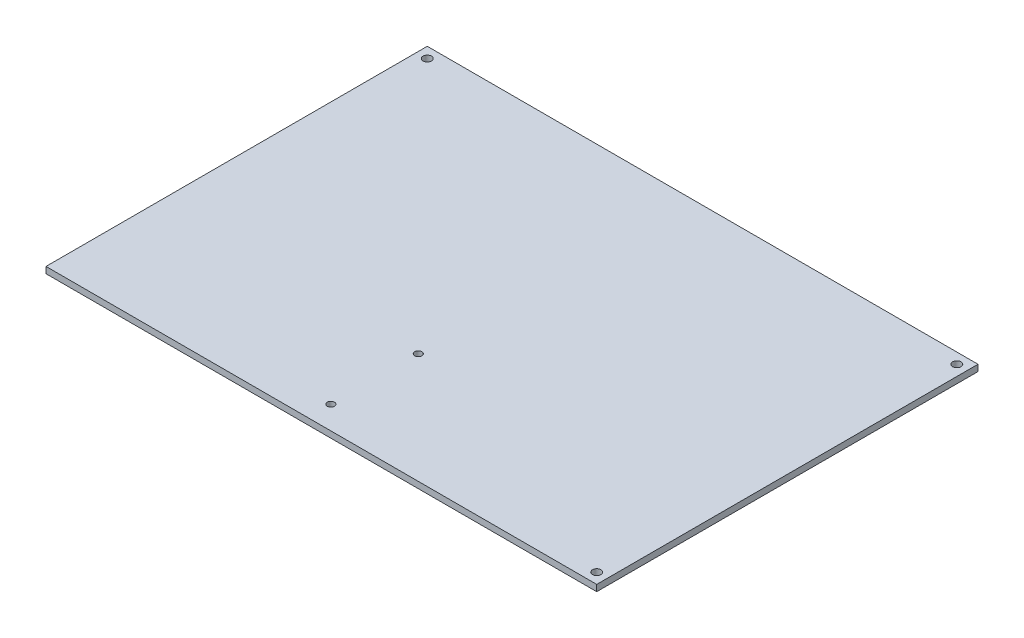
ISO-10303-21;
HEADER;
FILE_DESCRIPTION(('STEP AP214'),'2;1');
FILE_NAME('part.step','',(''),(''),'','','');
FILE_SCHEMA(('AUTOMOTIVE_DESIGN { 1 0 10303 214 1 1 1 1 }'));
ENDSEC;
DATA;
#1=APPLICATION_CONTEXT('core data for automotive mechanical design processes');
#2=APPLICATION_PROTOCOL_DEFINITION('international standard','automotive_design',2000,#1);
#3=PRODUCT_CONTEXT('',#1,'mechanical');
#4=PRODUCT('Part','Part','',(#3));
#5=PRODUCT_RELATED_PRODUCT_CATEGORY('part','',(#4));
#6=PRODUCT_DEFINITION_FORMATION('','',#4);
#7=PRODUCT_DEFINITION_CONTEXT('part definition',#1,'design');
#8=PRODUCT_DEFINITION('design','',#6,#7);
#9=PRODUCT_DEFINITION_SHAPE('','',#8);
#10=(LENGTH_UNIT() NAMED_UNIT(*) SI_UNIT(.MILLI.,.METRE.));
#11=(NAMED_UNIT(*) PLANE_ANGLE_UNIT() SI_UNIT($,.RADIAN.));
#12=(NAMED_UNIT(*) SI_UNIT($,.STERADIAN.) SOLID_ANGLE_UNIT());
#13=UNCERTAINTY_MEASURE_WITH_UNIT(LENGTH_MEASURE(1.E-05),#10,'distance_accuracy_value','');
#14=(GEOMETRIC_REPRESENTATION_CONTEXT(3) GLOBAL_UNCERTAINTY_ASSIGNED_CONTEXT((#13)) GLOBAL_UNIT_ASSIGNED_CONTEXT((#10,
#11,#12)) REPRESENTATION_CONTEXT('',''));
#15=CARTESIAN_POINT('',(0.,0.,0.));
#16=DIRECTION('',(0.,0.,1.));
#17=DIRECTION('',(1.,0.,0.));
#18=AXIS2_PLACEMENT_3D('',#15,#16,#17);
#19=CARTESIAN_POINT('',(-130.,3.,-90.));
#20=DIRECTION('',(1.,0.,0.));
#21=DIRECTION('',(0.,0.,-1.));
#22=AXIS2_PLACEMENT_3D('',#19,#20,#21);
#23=PLANE('',#22);
#24=DIRECTION('',(0.,0.,1.));
#25=VECTOR('',#24,1.);
#26=CARTESIAN_POINT('',(-130.,0.,-90.));
#27=LINE('',#26,#25);
#28=CARTESIAN_POINT('',(-130.,0.,-90.));
#29=VERTEX_POINT('',#28);
#30=CARTESIAN_POINT('',(-130.,0.,90.));
#31=VERTEX_POINT('',#30);
#32=EDGE_CURVE('E115',#29,#31,#27,.T.);
#33=ORIENTED_EDGE('',*,*,#32,.T.);
#34=DIRECTION('',(0.,-1.,0.));
#35=VECTOR('',#34,1.);
#36=CARTESIAN_POINT('',(-130.,3.,90.));
#37=LINE('',#36,#35);
#38=CARTESIAN_POINT('',(-130.,3.,90.));
#39=VERTEX_POINT('',#38);
#40=EDGE_CURVE('E11',#39,#31,#37,.T.);
#41=ORIENTED_EDGE('',*,*,#40,.F.);
#42=DIRECTION('',(0.,0.,1.));
#43=VECTOR('',#42,1.);
#44=CARTESIAN_POINT('',(-130.,3.,-90.));
#45=LINE('',#44,#43);
#46=CARTESIAN_POINT('',(-130.,3.,-90.));
#47=VERTEX_POINT('',#46);
#48=EDGE_CURVE('E98',#47,#39,#45,.T.);
#49=ORIENTED_EDGE('',*,*,#48,.F.);
#50=DIRECTION('',(0.,-1.,0.));
#51=VECTOR('',#50,1.);
#52=CARTESIAN_POINT('',(-130.,3.,-90.));
#53=LINE('',#52,#51);
#54=EDGE_CURVE('E111',#47,#29,#53,.T.);
#55=ORIENTED_EDGE('',*,*,#54,.T.);
#56=EDGE_LOOP('',(#33,#41,#49,#55));
#57=FACE_BOUND('',#56,.T.);
#58=ADVANCED_FACE('F44',(#57),#23,.F.);
#59=CARTESIAN_POINT('',(130.,3.,90.));
#60=DIRECTION('',(0.,0.,-1.));
#61=DIRECTION('',(-1.,0.,0.));
#62=AXIS2_PLACEMENT_3D('',#59,#60,#61);
#63=PLANE('',#62);
#64=DIRECTION('',(1.,0.,0.));
#65=VECTOR('',#64,1.);
#66=CARTESIAN_POINT('',(130.,0.,90.));
#67=LINE('',#66,#65);
#68=CARTESIAN_POINT('',(130.,0.,90.));
#69=VERTEX_POINT('',#68);
#70=EDGE_CURVE('E103',#31,#69,#67,.T.);
#71=ORIENTED_EDGE('',*,*,#70,.T.);
#72=DIRECTION('',(0.,-1.,0.));
#73=VECTOR('',#72,1.);
#74=CARTESIAN_POINT('',(130.,3.,90.));
#75=LINE('',#74,#73);
#76=CARTESIAN_POINT('',(130.,3.,90.));
#77=VERTEX_POINT('',#76);
#78=EDGE_CURVE('E54',#77,#69,#75,.T.);
#79=ORIENTED_EDGE('',*,*,#78,.F.);
#80=DIRECTION('',(1.,0.,0.));
#81=VECTOR('',#80,1.);
#82=CARTESIAN_POINT('',(130.,3.,90.));
#83=LINE('',#82,#81);
#84=EDGE_CURVE('E93',#39,#77,#83,.T.);
#85=ORIENTED_EDGE('',*,*,#84,.F.);
#86=ORIENTED_EDGE('',*,*,#40,.T.);
#87=EDGE_LOOP('',(#71,#79,#85,#86));
#88=FACE_BOUND('',#87,.T.);
#89=ADVANCED_FACE('F102',(#88),#63,.F.);
#90=CARTESIAN_POINT('',(130.,3.,-90.));
#91=DIRECTION('',(-1.,0.,0.));
#92=DIRECTION('',(0.,0.,1.));
#93=AXIS2_PLACEMENT_3D('',#90,#91,#92);
#94=PLANE('',#93);
#95=DIRECTION('',(0.,0.,-1.));
#96=VECTOR('',#95,1.);
#97=CARTESIAN_POINT('',(130.,0.,-90.));
#98=LINE('',#97,#96);
#99=CARTESIAN_POINT('',(130.,0.,-90.));
#100=VERTEX_POINT('',#99);
#101=EDGE_CURVE('E80',#69,#100,#98,.T.);
#102=ORIENTED_EDGE('',*,*,#101,.T.);
#103=DIRECTION('',(0.,-1.,0.));
#104=VECTOR('',#103,1.);
#105=CARTESIAN_POINT('',(130.,3.,-90.));
#106=LINE('',#105,#104);
#107=CARTESIAN_POINT('',(130.,3.,-90.));
#108=VERTEX_POINT('',#107);
#109=EDGE_CURVE('E105',#108,#100,#106,.T.);
#110=ORIENTED_EDGE('',*,*,#109,.F.);
#111=DIRECTION('',(0.,0.,-1.));
#112=VECTOR('',#111,1.);
#113=CARTESIAN_POINT('',(130.,3.,-90.));
#114=LINE('',#113,#112);
#115=EDGE_CURVE('E96',#77,#108,#114,.T.);
#116=ORIENTED_EDGE('',*,*,#115,.F.);
#117=ORIENTED_EDGE('',*,*,#78,.T.);
#118=EDGE_LOOP('',(#102,#110,#116,#117));
#119=FACE_BOUND('',#118,.T.);
#120=ADVANCED_FACE('F107',(#119),#94,.F.);
#121=CARTESIAN_POINT('',(130.,3.,-90.));
#122=DIRECTION('',(0.,0.,1.));
#123=DIRECTION('',(1.,0.,0.));
#124=AXIS2_PLACEMENT_3D('',#121,#122,#123);
#125=PLANE('',#124);
#126=DIRECTION('',(-1.,0.,0.));
#127=VECTOR('',#126,1.);
#128=CARTESIAN_POINT('',(130.,0.,-90.));
#129=LINE('',#128,#127);
#130=EDGE_CURVE('E86',#100,#29,#129,.T.);
#131=ORIENTED_EDGE('',*,*,#130,.T.);
#132=ORIENTED_EDGE('',*,*,#54,.F.);
#133=DIRECTION('',(-1.,0.,0.));
#134=VECTOR('',#133,1.);
#135=CARTESIAN_POINT('',(130.,3.,-90.));
#136=LINE('',#135,#134);
#137=EDGE_CURVE('E63',#108,#47,#136,.T.);
#138=ORIENTED_EDGE('',*,*,#137,.F.);
#139=ORIENTED_EDGE('',*,*,#109,.T.);
#140=EDGE_LOOP('',(#131,#132,#138,#139));
#141=FACE_BOUND('',#140,.T.);
#142=ADVANCED_FACE('F183',(#141),#125,.F.);
#143=CARTESIAN_POINT('',(0.,3.,0.));
#144=DIRECTION('',(0.,-1.,0.));
#145=DIRECTION('',(0.,0.,-1.));
#146=AXIS2_PLACEMENT_3D('',#143,#144,#145);
#147=PLANE('',#146);
#148=CARTESIAN_POINT('',(-6.425,3.,79.1006113931587));
#149=DIRECTION('',(0.,1.,0.));
#150=DIRECTION('',(0.,0.,1.));
#151=AXIS2_PLACEMENT_3D('',#148,#149,#150);
#152=CIRCLE('',#151,1.7);
#153=CARTESIAN_POINT('',(-6.425,3.,80.8006113931587));
#154=VERTEX_POINT('',#153);
#155=EDGE_CURVE('E132',#154,#154,#152,.T.);
#156=ORIENTED_EDGE('',*,*,#155,.F.);
#157=EDGE_LOOP('',(#156));
#158=FACE_BOUND('',#157,.T.);
#159=CARTESIAN_POINT('',(-6.425,3.,37.8256113931587));
#160=DIRECTION('',(0.,1.,0.));
#161=DIRECTION('',(0.,0.,1.));
#162=AXIS2_PLACEMENT_3D('',#159,#160,#161);
#163=CIRCLE('',#162,1.7);
#164=CARTESIAN_POINT('',(-6.425,3.,39.5256113931587));
#165=VERTEX_POINT('',#164);
#166=EDGE_CURVE('E140',#165,#165,#163,.T.);
#167=ORIENTED_EDGE('',*,*,#166,.F.);
#168=EDGE_LOOP('',(#167));
#169=FACE_BOUND('',#168,.T.);
#170=CARTESIAN_POINT('',(125.,3.,85.));
#171=DIRECTION('',(0.,1.,0.));
#172=DIRECTION('',(0.,0.,1.));
#173=AXIS2_PLACEMENT_3D('',#170,#171,#172);
#174=CIRCLE('',#173,2.);
#175=CARTESIAN_POINT('',(125.,3.,87.));
#176=VERTEX_POINT('',#175);
#177=EDGE_CURVE('E151',#176,#176,#174,.T.);
#178=ORIENTED_EDGE('',*,*,#177,.F.);
#179=EDGE_LOOP('',(#178));
#180=FACE_BOUND('',#179,.T.);
#181=CARTESIAN_POINT('',(125.,3.,-85.));
#182=DIRECTION('',(0.,1.,0.));
#183=DIRECTION('',(0.,0.,-1.));
#184=AXIS2_PLACEMENT_3D('',#181,#182,#183);
#185=CIRCLE('',#184,2.);
#186=CARTESIAN_POINT('',(125.,3.,-87.));
#187=VERTEX_POINT('',#186);
#188=EDGE_CURVE('E155',#187,#187,#185,.T.);
#189=ORIENTED_EDGE('',*,*,#188,.F.);
#190=EDGE_LOOP('',(#189));
#191=FACE_BOUND('',#190,.T.);
#192=CARTESIAN_POINT('',(-125.,3.,-84.9999999999999));
#193=DIRECTION('',(0.,1.,0.));
#194=DIRECTION('',(0.,0.,1.));
#195=AXIS2_PLACEMENT_3D('',#192,#193,#194);
#196=CIRCLE('',#195,2.);
#197=CARTESIAN_POINT('',(-125.,3.,-82.9999999999999));
#198=VERTEX_POINT('',#197);
#199=EDGE_CURVE('E163',#198,#198,#196,.T.);
#200=ORIENTED_EDGE('',*,*,#199,.F.);
#201=EDGE_LOOP('',(#200));
#202=FACE_BOUND('',#201,.T.);
#203=ORIENTED_EDGE('',*,*,#48,.T.);
#204=ORIENTED_EDGE('',*,*,#84,.T.);
#205=ORIENTED_EDGE('',*,*,#115,.T.);
#206=ORIENTED_EDGE('',*,*,#137,.T.);
#207=EDGE_LOOP('',(#203,#204,#205,#206));
#208=FACE_BOUND('',#207,.T.);
#209=ADVANCED_FACE('F94',(#158,#169,#180,#191,#202,#208),#147,.F.);
#210=CARTESIAN_POINT('',(0.,0.,0.));
#211=DIRECTION('',(0.,-1.,0.));
#212=DIRECTION('',(0.,0.,-1.));
#213=AXIS2_PLACEMENT_3D('',#210,#211,#212);
#214=PLANE('',#213);
#215=CARTESIAN_POINT('',(-6.425,0.,79.1006113931587));
#216=DIRECTION('',(0.,-1.,0.));
#217=DIRECTION('',(0.,0.,-1.));
#218=AXIS2_PLACEMENT_3D('',#215,#216,#217);
#219=CIRCLE('',#218,1.7);
#220=CARTESIAN_POINT('',(-6.425,0.,77.4006113931587));
#221=VERTEX_POINT('',#220);
#222=EDGE_CURVE('E47',#221,#221,#219,.T.);
#223=ORIENTED_EDGE('',*,*,#222,.F.);
#224=EDGE_LOOP('',(#223));
#225=FACE_BOUND('',#224,.T.);
#226=CARTESIAN_POINT('',(-6.425,0.,37.8256113931587));
#227=DIRECTION('',(0.,-1.,0.));
#228=DIRECTION('',(0.,0.,-1.));
#229=AXIS2_PLACEMENT_3D('',#226,#227,#228);
#230=CIRCLE('',#229,1.7);
#231=CARTESIAN_POINT('',(-6.425,0.,36.1256113931587));
#232=VERTEX_POINT('',#231);
#233=EDGE_CURVE('E129',#232,#232,#230,.T.);
#234=ORIENTED_EDGE('',*,*,#233,.F.);
#235=EDGE_LOOP('',(#234));
#236=FACE_BOUND('',#235,.T.);
#237=CARTESIAN_POINT('',(125.,0.,85.));
#238=DIRECTION('',(0.,1.,0.));
#239=DIRECTION('',(0.,0.,1.));
#240=AXIS2_PLACEMENT_3D('',#237,#238,#239);
#241=CIRCLE('',#240,2.);
#242=CARTESIAN_POINT('',(125.,0.,87.));
#243=VERTEX_POINT('',#242);
#244=EDGE_CURVE('E119',#243,#243,#241,.T.);
#245=ORIENTED_EDGE('',*,*,#244,.T.);
#246=EDGE_LOOP('',(#245));
#247=FACE_BOUND('',#246,.T.);
#248=CARTESIAN_POINT('',(125.,0.,-85.));
#249=DIRECTION('',(0.,1.,0.));
#250=DIRECTION('',(0.,0.,-1.));
#251=AXIS2_PLACEMENT_3D('',#248,#249,#250);
#252=CIRCLE('',#251,2.);
#253=CARTESIAN_POINT('',(125.,0.,-87.));
#254=VERTEX_POINT('',#253);
#255=EDGE_CURVE('E159',#254,#254,#252,.T.);
#256=ORIENTED_EDGE('',*,*,#255,.T.);
#257=EDGE_LOOP('',(#256));
#258=FACE_BOUND('',#257,.T.);
#259=CARTESIAN_POINT('',(-125.,0.,-84.9999999999999));
#260=DIRECTION('',(0.,1.,0.));
#261=DIRECTION('',(0.,0.,1.));
#262=AXIS2_PLACEMENT_3D('',#259,#260,#261);
#263=CIRCLE('',#262,2.);
#264=CARTESIAN_POINT('',(-125.,0.,-82.9999999999999));
#265=VERTEX_POINT('',#264);
#266=EDGE_CURVE('E138',#265,#265,#263,.T.);
#267=ORIENTED_EDGE('',*,*,#266,.T.);
#268=EDGE_LOOP('',(#267));
#269=FACE_BOUND('',#268,.T.);
#270=ORIENTED_EDGE('',*,*,#32,.F.);
#271=ORIENTED_EDGE('',*,*,#130,.F.);
#272=ORIENTED_EDGE('',*,*,#101,.F.);
#273=ORIENTED_EDGE('',*,*,#70,.F.);
#274=EDGE_LOOP('',(#270,#271,#272,#273));
#275=FACE_BOUND('',#274,.T.);
#276=ADVANCED_FACE('F172',(#225,#236,#247,#258,#269,#275),#214,.T.);
#277=CARTESIAN_POINT('',(-125.,0.,-84.9999999999999));
#278=DIRECTION('',(0.,1.,0.));
#279=DIRECTION('',(0.,0.,1.));
#280=AXIS2_PLACEMENT_3D('',#277,#278,#279);
#281=CYLINDRICAL_SURFACE('',#280,2.);
#282=ORIENTED_EDGE('',*,*,#266,.F.);
#283=EDGE_LOOP('',(#282));
#284=FACE_BOUND('',#283,.T.);
#285=ORIENTED_EDGE('',*,*,#199,.T.);
#286=EDGE_LOOP('',(#285));
#287=FACE_BOUND('',#286,.T.);
#288=ADVANCED_FACE('F175',(#284,#287),#281,.F.);
#289=CARTESIAN_POINT('',(125.,0.,-85.));
#290=DIRECTION('',(0.,1.,0.));
#291=DIRECTION('',(0.,0.,1.));
#292=AXIS2_PLACEMENT_3D('',#289,#290,#291);
#293=CYLINDRICAL_SURFACE('',#292,2.);
#294=ORIENTED_EDGE('',*,*,#255,.F.);
#295=EDGE_LOOP('',(#294));
#296=FACE_BOUND('',#295,.T.);
#297=ORIENTED_EDGE('',*,*,#188,.T.);
#298=EDGE_LOOP('',(#297));
#299=FACE_BOUND('',#298,.T.);
#300=ADVANCED_FACE('F178',(#296,#299),#293,.F.);
#301=CARTESIAN_POINT('',(125.,0.,85.));
#302=DIRECTION('',(0.,1.,0.));
#303=DIRECTION('',(0.,0.,1.));
#304=AXIS2_PLACEMENT_3D('',#301,#302,#303);
#305=CYLINDRICAL_SURFACE('',#304,2.);
#306=ORIENTED_EDGE('',*,*,#244,.F.);
#307=EDGE_LOOP('',(#306));
#308=FACE_BOUND('',#307,.T.);
#309=ORIENTED_EDGE('',*,*,#177,.T.);
#310=EDGE_LOOP('',(#309));
#311=FACE_BOUND('',#310,.T.);
#312=ADVANCED_FACE('F224',(#308,#311),#305,.F.);
#313=CARTESIAN_POINT('',(-6.425,-7.,37.8256113931587));
#314=DIRECTION('',(0.,1.,0.));
#315=DIRECTION('',(0.,0.,1.));
#316=AXIS2_PLACEMENT_3D('',#313,#314,#315);
#317=CYLINDRICAL_SURFACE('',#316,1.7);
#318=ORIENTED_EDGE('',*,*,#233,.T.);
#319=EDGE_LOOP('',(#318));
#320=FACE_BOUND('',#319,.T.);
#321=ORIENTED_EDGE('',*,*,#166,.T.);
#322=EDGE_LOOP('',(#321));
#323=FACE_BOUND('',#322,.T.);
#324=ADVANCED_FACE('F232',(#320,#323),#317,.F.);
#325=CARTESIAN_POINT('',(-6.425,-7.,79.1006113931587));
#326=DIRECTION('',(0.,1.,0.));
#327=DIRECTION('',(0.,0.,1.));
#328=AXIS2_PLACEMENT_3D('',#325,#326,#327);
#329=CYLINDRICAL_SURFACE('',#328,1.7);
#330=ORIENTED_EDGE('',*,*,#222,.T.);
#331=EDGE_LOOP('',(#330));
#332=FACE_BOUND('',#331,.T.);
#333=ORIENTED_EDGE('',*,*,#155,.T.);
#334=EDGE_LOOP('',(#333));
#335=FACE_BOUND('',#334,.T.);
#336=ADVANCED_FACE('F245',(#332,#335),#329,.F.);
#337=CLOSED_SHELL('',(#58,#89,#120,#142,#209,#276,#288,#300,#312,#324,#336));
#338=MANIFOLD_SOLID_BREP('B2',#337);
#339=ADVANCED_BREP_SHAPE_REPRESENTATION('',(#18,#338),#14);
#340=SHAPE_DEFINITION_REPRESENTATION(#9,#339);
ENDSEC;
END-ISO-10303-21;
